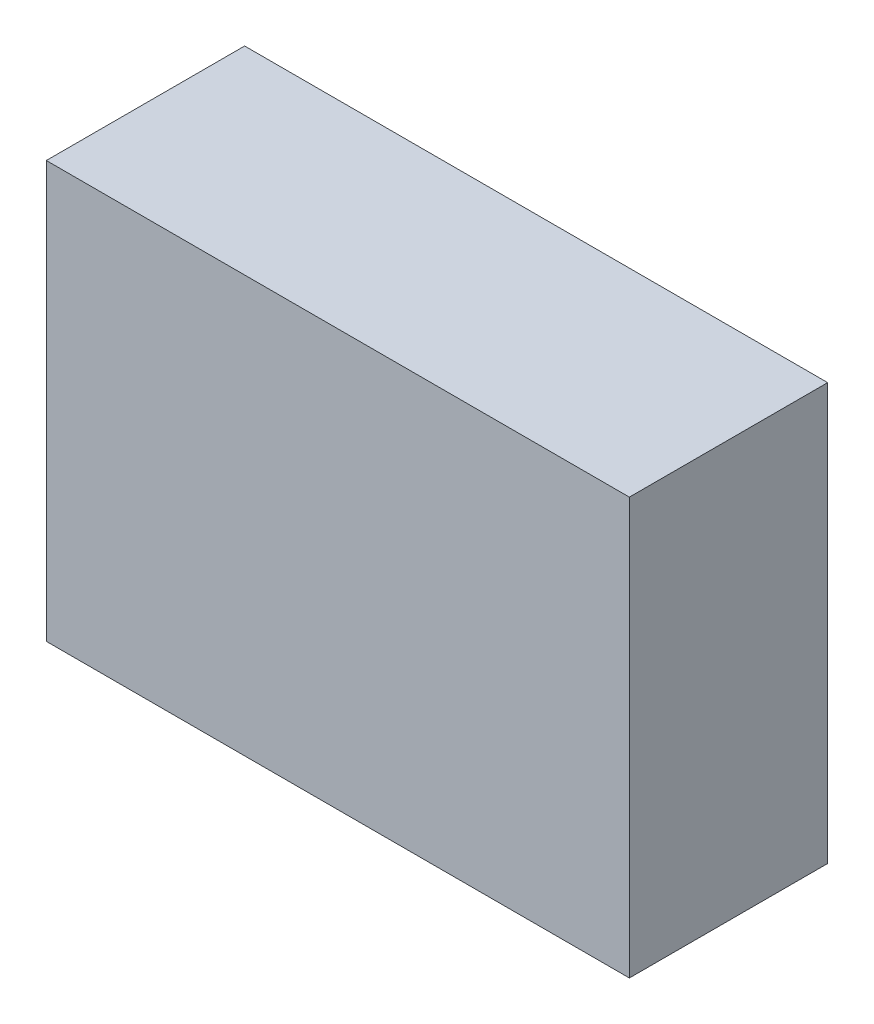
ISO-10303-21;
HEADER;
FILE_DESCRIPTION(('STEP AP214'),'2;1');
FILE_NAME('part.step','',(''),(''),'','','');
FILE_SCHEMA(('AUTOMOTIVE_DESIGN { 1 0 10303 214 1 1 1 1 }'));
ENDSEC;
DATA;
#1=APPLICATION_CONTEXT('core data for automotive mechanical design processes');
#2=APPLICATION_PROTOCOL_DEFINITION('international standard','automotive_design',2000,#1);
#3=PRODUCT_CONTEXT('',#1,'mechanical');
#4=PRODUCT('Part','Part','',(#3));
#5=PRODUCT_RELATED_PRODUCT_CATEGORY('part','',(#4));
#6=PRODUCT_DEFINITION_FORMATION('','',#4);
#7=PRODUCT_DEFINITION_CONTEXT('part definition',#1,'design');
#8=PRODUCT_DEFINITION('design','',#6,#7);
#9=PRODUCT_DEFINITION_SHAPE('','',#8);
#10=(LENGTH_UNIT() NAMED_UNIT(*) SI_UNIT(.MILLI.,.METRE.));
#11=(NAMED_UNIT(*) PLANE_ANGLE_UNIT() SI_UNIT($,.RADIAN.));
#12=(NAMED_UNIT(*) SI_UNIT($,.STERADIAN.) SOLID_ANGLE_UNIT());
#13=UNCERTAINTY_MEASURE_WITH_UNIT(LENGTH_MEASURE(1.E-05),#10,'distance_accuracy_value','');
#14=(GEOMETRIC_REPRESENTATION_CONTEXT(3) GLOBAL_UNCERTAINTY_ASSIGNED_CONTEXT((#13)) GLOBAL_UNIT_ASSIGNED_CONTEXT((#10,
#11,#12)) REPRESENTATION_CONTEXT('',''));
#15=CARTESIAN_POINT('',(0.,0.,0.));
#16=DIRECTION('',(0.,0.,1.));
#17=DIRECTION('',(1.,0.,0.));
#18=AXIS2_PLACEMENT_3D('',#15,#16,#17);
#19=CARTESIAN_POINT('',(10.3858695652174,103.459239130435,50.));
#20=DIRECTION('',(-1.,0.,0.));
#21=DIRECTION('',(0.,-1.,0.));
#22=AXIS2_PLACEMENT_3D('',#19,#20,#21);
#23=PLANE('',#22);
#24=DIRECTION('',(0.,1.,0.));
#25=VECTOR('',#24,1.);
#26=CARTESIAN_POINT('',(10.3858695652174,103.459239130435,0.));
#27=LINE('',#26,#25);
#28=CARTESIAN_POINT('',(10.3858695652174,-1.54076086956523,0.));
#29=VERTEX_POINT('',#28);
#30=CARTESIAN_POINT('',(10.3858695652174,103.459239130435,0.));
#31=VERTEX_POINT('',#30);
#32=EDGE_CURVE('E100',#29,#31,#27,.T.);
#33=ORIENTED_EDGE('',*,*,#32,.T.);
#34=DIRECTION('',(0.,0.,-1.));
#35=VECTOR('',#34,1.);
#36=CARTESIAN_POINT('',(10.3858695652174,103.459239130435,50.));
#37=LINE('',#36,#35);
#38=CARTESIAN_POINT('',(10.3858695652174,103.459239130435,50.));
#39=VERTEX_POINT('',#38);
#40=EDGE_CURVE('E11',#39,#31,#37,.T.);
#41=ORIENTED_EDGE('',*,*,#40,.F.);
#42=DIRECTION('',(0.,1.,0.));
#43=VECTOR('',#42,1.);
#44=CARTESIAN_POINT('',(10.3858695652174,103.459239130435,50.));
#45=LINE('',#44,#43);
#46=CARTESIAN_POINT('',(10.3858695652174,-1.54076086956523,50.));
#47=VERTEX_POINT('',#46);
#48=EDGE_CURVE('E88',#47,#39,#45,.T.);
#49=ORIENTED_EDGE('',*,*,#48,.F.);
#50=DIRECTION('',(0.,0.,-1.));
#51=VECTOR('',#50,1.);
#52=CARTESIAN_POINT('',(10.3858695652174,-1.54076086956523,50.));
#53=LINE('',#52,#51);
#54=EDGE_CURVE('E96',#47,#29,#53,.T.);
#55=ORIENTED_EDGE('',*,*,#54,.T.);
#56=EDGE_LOOP('',(#33,#41,#49,#55));
#57=FACE_BOUND('',#56,.T.);
#58=ADVANCED_FACE('F37',(#57),#23,.F.);
#59=CARTESIAN_POINT('',(-136.614130434783,103.459239130435,50.));
#60=DIRECTION('',(0.,-1.,0.));
#61=DIRECTION('',(0.,0.,-1.));
#62=AXIS2_PLACEMENT_3D('',#59,#60,#61);
#63=PLANE('',#62);
#64=DIRECTION('',(-1.,0.,0.));
#65=VECTOR('',#64,1.);
#66=CARTESIAN_POINT('',(-136.614130434783,103.459239130435,0.));
#67=LINE('',#66,#65);
#68=CARTESIAN_POINT('',(-136.614130434783,103.459239130435,0.));
#69=VERTEX_POINT('',#68);
#70=EDGE_CURVE('E92',#31,#69,#67,.T.);
#71=ORIENTED_EDGE('',*,*,#70,.T.);
#72=DIRECTION('',(0.,0.,-1.));
#73=VECTOR('',#72,1.);
#74=CARTESIAN_POINT('',(-136.614130434783,103.459239130435,50.));
#75=LINE('',#74,#73);
#76=CARTESIAN_POINT('',(-136.614130434783,103.459239130435,50.));
#77=VERTEX_POINT('',#76);
#78=EDGE_CURVE('E45',#77,#69,#75,.T.);
#79=ORIENTED_EDGE('',*,*,#78,.F.);
#80=DIRECTION('',(-1.,0.,0.));
#81=VECTOR('',#80,1.);
#82=CARTESIAN_POINT('',(-136.614130434783,103.459239130435,50.));
#83=LINE('',#82,#81);
#84=EDGE_CURVE('E83',#39,#77,#83,.T.);
#85=ORIENTED_EDGE('',*,*,#84,.F.);
#86=ORIENTED_EDGE('',*,*,#40,.T.);
#87=EDGE_LOOP('',(#71,#79,#85,#86));
#88=FACE_BOUND('',#87,.T.);
#89=ADVANCED_FACE('F91',(#88),#63,.F.);
#90=CARTESIAN_POINT('',(-136.614130434783,103.459239130435,50.));
#91=DIRECTION('',(1.,0.,0.));
#92=DIRECTION('',(0.,0.,-1.));
#93=AXIS2_PLACEMENT_3D('',#90,#91,#92);
#94=PLANE('',#93);
#95=DIRECTION('',(0.,-1.,0.));
#96=VECTOR('',#95,1.);
#97=CARTESIAN_POINT('',(-136.614130434783,103.459239130435,0.));
#98=LINE('',#97,#96);
#99=CARTESIAN_POINT('',(-136.614130434783,-1.54076086956523,0.));
#100=VERTEX_POINT('',#99);
#101=EDGE_CURVE('E70',#69,#100,#98,.T.);
#102=ORIENTED_EDGE('',*,*,#101,.T.);
#103=DIRECTION('',(0.,0.,-1.));
#104=VECTOR('',#103,1.);
#105=CARTESIAN_POINT('',(-136.614130434783,-1.54076086956523,50.));
#106=LINE('',#105,#104);
#107=CARTESIAN_POINT('',(-136.614130434783,-1.54076086956523,50.));
#108=VERTEX_POINT('',#107);
#109=EDGE_CURVE('E93',#108,#100,#106,.T.);
#110=ORIENTED_EDGE('',*,*,#109,.F.);
#111=DIRECTION('',(0.,-1.,0.));
#112=VECTOR('',#111,1.);
#113=CARTESIAN_POINT('',(-136.614130434783,103.459239130435,50.));
#114=LINE('',#113,#112);
#115=EDGE_CURVE('E86',#77,#108,#114,.T.);
#116=ORIENTED_EDGE('',*,*,#115,.F.);
#117=ORIENTED_EDGE('',*,*,#78,.T.);
#118=EDGE_LOOP('',(#102,#110,#116,#117));
#119=FACE_BOUND('',#118,.T.);
#120=ADVANCED_FACE('F94',(#119),#94,.F.);
#121=CARTESIAN_POINT('',(-136.614130434783,-1.54076086956523,50.));
#122=DIRECTION('',(0.,1.,0.));
#123=DIRECTION('',(0.,0.,1.));
#124=AXIS2_PLACEMENT_3D('',#121,#122,#123);
#125=PLANE('',#124);
#126=DIRECTION('',(1.,0.,0.));
#127=VECTOR('',#126,1.);
#128=CARTESIAN_POINT('',(-136.614130434783,-1.54076086956523,0.));
#129=LINE('',#128,#127);
#130=EDGE_CURVE('E76',#100,#29,#129,.T.);
#131=ORIENTED_EDGE('',*,*,#130,.T.);
#132=ORIENTED_EDGE('',*,*,#54,.F.);
#133=DIRECTION('',(1.,0.,0.));
#134=VECTOR('',#133,1.);
#135=CARTESIAN_POINT('',(-136.614130434783,-1.54076086956523,50.));
#136=LINE('',#135,#134);
#137=EDGE_CURVE('E53',#108,#47,#136,.T.);
#138=ORIENTED_EDGE('',*,*,#137,.F.);
#139=ORIENTED_EDGE('',*,*,#109,.T.);
#140=EDGE_LOOP('',(#131,#132,#138,#139));
#141=FACE_BOUND('',#140,.T.);
#142=ADVANCED_FACE('F107',(#141),#125,.F.);
#143=CARTESIAN_POINT('',(0.,0.,50.));
#144=DIRECTION('',(0.,0.,1.));
#145=DIRECTION('',(1.,0.,0.));
#146=AXIS2_PLACEMENT_3D('',#143,#144,#145);
#147=PLANE('',#146);
#148=ORIENTED_EDGE('',*,*,#48,.T.);
#149=ORIENTED_EDGE('',*,*,#84,.T.);
#150=ORIENTED_EDGE('',*,*,#115,.T.);
#151=ORIENTED_EDGE('',*,*,#137,.T.);
#152=EDGE_LOOP('',(#148,#149,#150,#151));
#153=FACE_BOUND('',#152,.T.);
#154=ADVANCED_FACE('F84',(#153),#147,.T.);
#155=CARTESIAN_POINT('',(0.,0.,0.));
#156=DIRECTION('',(0.,0.,1.));
#157=DIRECTION('',(1.,0.,0.));
#158=AXIS2_PLACEMENT_3D('',#155,#156,#157);
#159=PLANE('',#158);
#160=ORIENTED_EDGE('',*,*,#32,.F.);
#161=ORIENTED_EDGE('',*,*,#130,.F.);
#162=ORIENTED_EDGE('',*,*,#101,.F.);
#163=ORIENTED_EDGE('',*,*,#70,.F.);
#164=EDGE_LOOP('',(#160,#161,#162,#163));
#165=FACE_BOUND('',#164,.T.);
#166=ADVANCED_FACE('F110',(#165),#159,.F.);
#167=CLOSED_SHELL('',(#58,#89,#120,#142,#154,#166));
#168=MANIFOLD_SOLID_BREP('B2',#167);
#169=ADVANCED_BREP_SHAPE_REPRESENTATION('',(#18,#168),#14);
#170=SHAPE_DEFINITION_REPRESENTATION(#9,#169);
ENDSEC;
END-ISO-10303-21;
